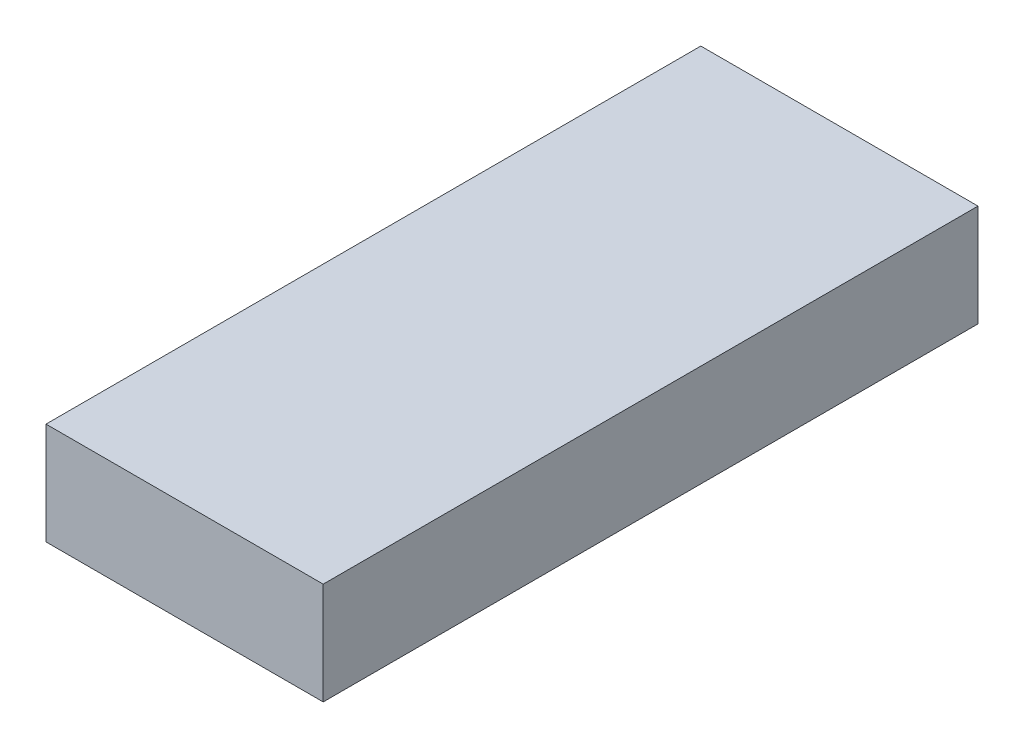
ISO-10303-21;
HEADER;
FILE_DESCRIPTION(('STEP AP214'),'2;1');
FILE_NAME('part.step','',(''),(''),'','','');
FILE_SCHEMA(('AUTOMOTIVE_DESIGN { 1 0 10303 214 1 1 1 1 }'));
ENDSEC;
DATA;
#1=APPLICATION_CONTEXT('core data for automotive mechanical design processes');
#2=APPLICATION_PROTOCOL_DEFINITION('international standard','automotive_design',2000,#1);
#3=PRODUCT_CONTEXT('',#1,'mechanical');
#4=PRODUCT('Part','Part','',(#3));
#5=PRODUCT_RELATED_PRODUCT_CATEGORY('part','',(#4));
#6=PRODUCT_DEFINITION_FORMATION('','',#4);
#7=PRODUCT_DEFINITION_CONTEXT('part definition',#1,'design');
#8=PRODUCT_DEFINITION('design','',#6,#7);
#9=PRODUCT_DEFINITION_SHAPE('','',#8);
#10=(LENGTH_UNIT() NAMED_UNIT(*) SI_UNIT(.MILLI.,.METRE.));
#11=(NAMED_UNIT(*) PLANE_ANGLE_UNIT() SI_UNIT($,.RADIAN.));
#12=(NAMED_UNIT(*) SI_UNIT($,.STERADIAN.) SOLID_ANGLE_UNIT());
#13=UNCERTAINTY_MEASURE_WITH_UNIT(LENGTH_MEASURE(1.E-05),#10,'distance_accuracy_value','');
#14=(GEOMETRIC_REPRESENTATION_CONTEXT(3) GLOBAL_UNCERTAINTY_ASSIGNED_CONTEXT((#13)) GLOBAL_UNIT_ASSIGNED_CONTEXT((#10,
#11,#12)) REPRESENTATION_CONTEXT('',''));
#15=CARTESIAN_POINT('',(0.,0.,0.));
#16=DIRECTION('',(0.,0.,1.));
#17=DIRECTION('',(1.,0.,0.));
#18=AXIS2_PLACEMENT_3D('',#15,#16,#17);
#19=CARTESIAN_POINT('',(-0.508,-0.18699988,0.));
#20=DIRECTION('',(0.,1.,0.));
#21=DIRECTION('',(0.,0.,1.));
#22=AXIS2_PLACEMENT_3D('',#19,#20,#21);
#23=PLANE('',#22);
#24=DIRECTION('',(0.,0.,1.));
#25=VECTOR('',#24,1.);
#26=CARTESIAN_POINT('',(0.508,-0.18699988,0.));
#27=LINE('',#26,#25);
#28=CARTESIAN_POINT('',(0.508,-0.18699988,0.));
#29=VERTEX_POINT('',#28);
#30=CARTESIAN_POINT('',(0.508,-0.18699988,2.40000028));
#31=VERTEX_POINT('',#30);
#32=EDGE_CURVE('E58',#29,#31,#27,.T.);
#33=ORIENTED_EDGE('',*,*,#32,.T.);
#34=DIRECTION('',(-1.,0.,0.));
#35=VECTOR('',#34,1.);
#36=CARTESIAN_POINT('',(0.508,-0.18699988,2.40000028));
#37=LINE('',#36,#35);
#38=CARTESIAN_POINT('',(-0.508,-0.18699988,2.40000028));
#39=VERTEX_POINT('',#38);
#40=EDGE_CURVE('E55',#31,#39,#37,.T.);
#41=ORIENTED_EDGE('',*,*,#40,.T.);
#42=DIRECTION('',(0.,0.,-1.));
#43=VECTOR('',#42,1.);
#44=CARTESIAN_POINT('',(-0.508,-0.18699988,0.));
#45=LINE('',#44,#43);
#46=CARTESIAN_POINT('',(-0.508,-0.18699988,0.));
#47=VERTEX_POINT('',#46);
#48=EDGE_CURVE('E77',#39,#47,#45,.T.);
#49=ORIENTED_EDGE('',*,*,#48,.T.);
#50=DIRECTION('',(1.,0.,0.));
#51=VECTOR('',#50,1.);
#52=CARTESIAN_POINT('',(-0.508,-0.18699988,0.));
#53=LINE('',#52,#51);
#54=EDGE_CURVE('E20',#29,#47,#53,.F.);
#55=ORIENTED_EDGE('',*,*,#54,.F.);
#56=EDGE_LOOP('',(#33,#41,#49,#55));
#57=FACE_BOUND('',#56,.T.);
#58=ADVANCED_FACE('F17',(#57),#23,.F.);
#59=CARTESIAN_POINT('',(0.508,-0.18699988,0.));
#60=DIRECTION('',(-1.,0.,0.));
#61=DIRECTION('',(0.,0.,1.));
#62=AXIS2_PLACEMENT_3D('',#59,#60,#61);
#63=PLANE('',#62);
#64=DIRECTION('',(0.,0.,-1.));
#65=VECTOR('',#64,1.);
#66=CARTESIAN_POINT('',(0.508,0.18699988,0.));
#67=LINE('',#66,#65);
#68=CARTESIAN_POINT('',(0.508,0.18699988,0.));
#69=VERTEX_POINT('',#68);
#70=CARTESIAN_POINT('',(0.508,0.18699988,2.40000028));
#71=VERTEX_POINT('',#70);
#72=EDGE_CURVE('E73',#69,#71,#67,.F.);
#73=ORIENTED_EDGE('',*,*,#72,.T.);
#74=DIRECTION('',(0.,1.,0.));
#75=VECTOR('',#74,1.);
#76=CARTESIAN_POINT('',(0.508,0.18699988,2.40000028));
#77=LINE('',#76,#75);
#78=EDGE_CURVE('E63',#71,#31,#77,.F.);
#79=ORIENTED_EDGE('',*,*,#78,.T.);
#80=ORIENTED_EDGE('',*,*,#32,.F.);
#81=DIRECTION('',(0.,1.,0.));
#82=VECTOR('',#81,1.);
#83=CARTESIAN_POINT('',(0.508,0.18699988,0.));
#84=LINE('',#83,#82);
#85=EDGE_CURVE('E79',#69,#29,#84,.F.);
#86=ORIENTED_EDGE('',*,*,#85,.F.);
#87=EDGE_LOOP('',(#73,#79,#80,#86));
#88=FACE_BOUND('',#87,.T.);
#89=ADVANCED_FACE('F72',(#88),#63,.F.);
#90=CARTESIAN_POINT('',(0.508,0.18699988,2.40000028));
#91=DIRECTION('',(0.,0.,-1.));
#92=DIRECTION('',(-1.,0.,0.));
#93=AXIS2_PLACEMENT_3D('',#90,#91,#92);
#94=PLANE('',#93);
#95=DIRECTION('',(0.,1.,0.));
#96=VECTOR('',#95,1.);
#97=CARTESIAN_POINT('',(-0.508,0.18699988,2.40000028));
#98=LINE('',#97,#96);
#99=CARTESIAN_POINT('',(-0.508,0.18699988,2.40000028));
#100=VERTEX_POINT('',#99);
#101=EDGE_CURVE('E69',#100,#39,#98,.F.);
#102=ORIENTED_EDGE('',*,*,#101,.T.);
#103=ORIENTED_EDGE('',*,*,#40,.F.);
#104=ORIENTED_EDGE('',*,*,#78,.F.);
#105=DIRECTION('',(1.,0.,0.));
#106=VECTOR('',#105,1.);
#107=CARTESIAN_POINT('',(0.508,0.18699988,2.40000028));
#108=LINE('',#107,#106);
#109=EDGE_CURVE('E83',#71,#100,#108,.F.);
#110=ORIENTED_EDGE('',*,*,#109,.T.);
#111=EDGE_LOOP('',(#102,#103,#104,#110));
#112=FACE_BOUND('',#111,.T.);
#113=ADVANCED_FACE('F66',(#112),#94,.F.);
#114=CARTESIAN_POINT('',(-0.508,0.18699988,0.));
#115=DIRECTION('',(1.,0.,0.));
#116=DIRECTION('',(0.,0.,-1.));
#117=AXIS2_PLACEMENT_3D('',#114,#115,#116);
#118=PLANE('',#117);
#119=ORIENTED_EDGE('',*,*,#48,.F.);
#120=ORIENTED_EDGE('',*,*,#101,.F.);
#121=DIRECTION('',(0.,0.,-1.));
#122=VECTOR('',#121,1.);
#123=CARTESIAN_POINT('',(-0.508,0.18699988,0.));
#124=LINE('',#123,#122);
#125=CARTESIAN_POINT('',(-0.508,0.18699988,0.));
#126=VERTEX_POINT('',#125);
#127=EDGE_CURVE('E26',#100,#126,#124,.T.);
#128=ORIENTED_EDGE('',*,*,#127,.T.);
#129=DIRECTION('',(0.,1.,0.));
#130=VECTOR('',#129,1.);
#131=CARTESIAN_POINT('',(-0.508,0.18699988,0.));
#132=LINE('',#131,#130);
#133=EDGE_CURVE('E34',#47,#126,#132,.T.);
#134=ORIENTED_EDGE('',*,*,#133,.F.);
#135=EDGE_LOOP('',(#119,#120,#128,#134));
#136=FACE_BOUND('',#135,.T.);
#137=ADVANCED_FACE('F88',(#136),#118,.F.);
#138=CARTESIAN_POINT('',(0.508,0.18699988,0.));
#139=DIRECTION('',(0.,0.,-1.));
#140=DIRECTION('',(-1.,0.,0.));
#141=AXIS2_PLACEMENT_3D('',#138,#139,#140);
#142=PLANE('',#141);
#143=ORIENTED_EDGE('',*,*,#133,.T.);
#144=DIRECTION('',(1.,0.,0.));
#145=VECTOR('',#144,1.);
#146=CARTESIAN_POINT('',(0.508,0.18699988,0.));
#147=LINE('',#146,#145);
#148=EDGE_CURVE('E11',#126,#69,#147,.T.);
#149=ORIENTED_EDGE('',*,*,#148,.T.);
#150=ORIENTED_EDGE('',*,*,#85,.T.);
#151=ORIENTED_EDGE('',*,*,#54,.T.);
#152=EDGE_LOOP('',(#143,#149,#150,#151));
#153=FACE_BOUND('',#152,.T.);
#154=ADVANCED_FACE('F91',(#153),#142,.T.);
#155=CARTESIAN_POINT('',(0.508,0.18699988,0.));
#156=DIRECTION('',(0.,-1.,0.));
#157=DIRECTION('',(0.,0.,-1.));
#158=AXIS2_PLACEMENT_3D('',#155,#156,#157);
#159=PLANE('',#158);
#160=ORIENTED_EDGE('',*,*,#127,.F.);
#161=ORIENTED_EDGE('',*,*,#109,.F.);
#162=ORIENTED_EDGE('',*,*,#72,.F.);
#163=ORIENTED_EDGE('',*,*,#148,.F.);
#164=EDGE_LOOP('',(#160,#161,#162,#163));
#165=FACE_BOUND('',#164,.T.);
#166=ADVANCED_FACE('F90',(#165),#159,.F.);
#167=CLOSED_SHELL('',(#58,#89,#113,#137,#154,#166));
#168=MANIFOLD_SOLID_BREP('B1',#167);
#169=ADVANCED_BREP_SHAPE_REPRESENTATION('',(#18,#168),#14);
#170=SHAPE_DEFINITION_REPRESENTATION(#9,#169);
ENDSEC;
END-ISO-10303-21;
